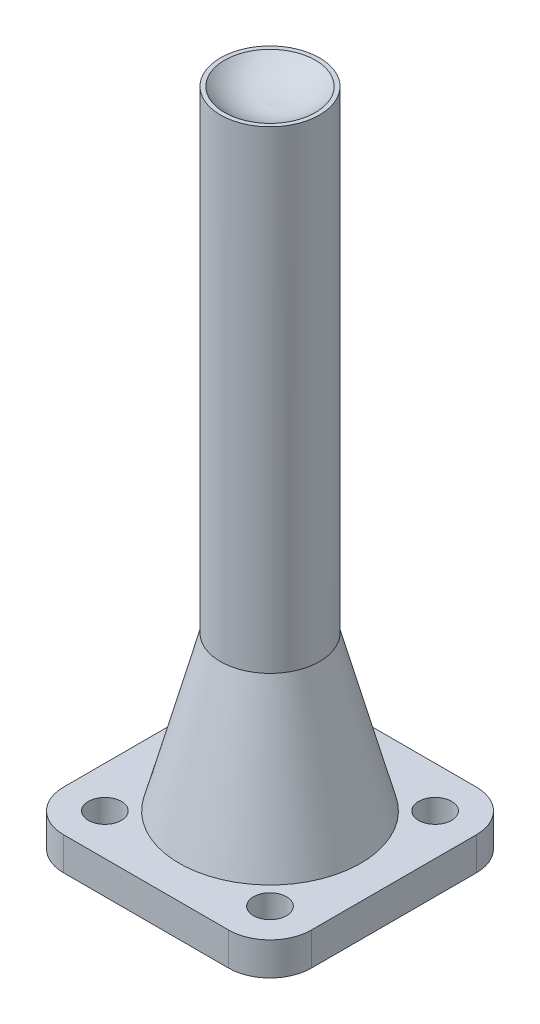
ISO-10303-21;
HEADER;
FILE_DESCRIPTION(('STEP AP214'),'2;1');
FILE_NAME('part.step','',(''),(''),'','','');
FILE_SCHEMA(('AUTOMOTIVE_DESIGN { 1 0 10303 214 1 1 1 1 }'));
ENDSEC;
DATA;
#1=APPLICATION_CONTEXT('core data for automotive mechanical design processes');
#2=APPLICATION_PROTOCOL_DEFINITION('international standard','automotive_design',2000,#1);
#3=PRODUCT_CONTEXT('',#1,'mechanical');
#4=PRODUCT('Part','Part','',(#3));
#5=PRODUCT_RELATED_PRODUCT_CATEGORY('part','',(#4));
#6=PRODUCT_DEFINITION_FORMATION('','',#4);
#7=PRODUCT_DEFINITION_CONTEXT('part definition',#1,'design');
#8=PRODUCT_DEFINITION('design','',#6,#7);
#9=PRODUCT_DEFINITION_SHAPE('','',#8);
#10=(LENGTH_UNIT() NAMED_UNIT(*) SI_UNIT(.MILLI.,.METRE.));
#11=(NAMED_UNIT(*) PLANE_ANGLE_UNIT() SI_UNIT($,.RADIAN.));
#12=(NAMED_UNIT(*) SI_UNIT($,.STERADIAN.) SOLID_ANGLE_UNIT());
#13=UNCERTAINTY_MEASURE_WITH_UNIT(LENGTH_MEASURE(1.E-05),#10,'distance_accuracy_value','');
#14=(GEOMETRIC_REPRESENTATION_CONTEXT(3) GLOBAL_UNCERTAINTY_ASSIGNED_CONTEXT((#13)) GLOBAL_UNIT_ASSIGNED_CONTEXT((#10,
#11,#12)) REPRESENTATION_CONTEXT('',''));
#15=CARTESIAN_POINT('',(0.,0.,0.));
#16=DIRECTION('',(0.,0.,1.));
#17=DIRECTION('',(1.,0.,0.));
#18=AXIS2_PLACEMENT_3D('',#15,#16,#17);
#19=CARTESIAN_POINT('',(0.,4.,0.));
#20=DIRECTION('',(0.,-1.,0.));
#21=DIRECTION('',(0.,0.,-1.));
#22=AXIS2_PLACEMENT_3D('',#19,#20,#21);
#23=PLANE('',#22);
#24=CARTESIAN_POINT('',(0.,4.,0.));
#25=DIRECTION('',(0.,-1.,0.));
#26=DIRECTION('',(0.,0.,-1.));
#27=AXIS2_PLACEMENT_3D('',#24,#25,#26);
#28=CIRCLE('',#27,11.);
#29=CARTESIAN_POINT('',(0.,4.,-11.));
#30=VERTEX_POINT('',#29);
#31=EDGE_CURVE('E11',#30,#30,#28,.T.);
#32=ORIENTED_EDGE('',*,*,#31,.T.);
#33=EDGE_LOOP('',(#32));
#34=FACE_BOUND('',#33,.T.);
#35=DIRECTION('',(1.,0.,0.));
#36=VECTOR('',#35,1.);
#37=CARTESIAN_POINT('',(-15.,4.,15.));
#38=LINE('',#37,#36);
#39=CARTESIAN_POINT('',(-10.,4.,15.));
#40=VERTEX_POINT('',#39);
#41=CARTESIAN_POINT('',(10.,4.,15.));
#42=VERTEX_POINT('',#41);
#43=EDGE_CURVE('E156',#40,#42,#38,.T.);
#44=ORIENTED_EDGE('',*,*,#43,.T.);
#45=CARTESIAN_POINT('',(10.,4.,10.));
#46=DIRECTION('',(0.,-1.,0.));
#47=DIRECTION('',(0.,0.,-1.));
#48=AXIS2_PLACEMENT_3D('',#45,#46,#47);
#49=CIRCLE('',#48,5.);
#50=CARTESIAN_POINT('',(15.,4.,10.));
#51=VERTEX_POINT('',#50);
#52=EDGE_CURVE('E191',#42,#51,#49,.F.);
#53=ORIENTED_EDGE('',*,*,#52,.T.);
#54=DIRECTION('',(0.,0.,-1.));
#55=VECTOR('',#54,1.);
#56=CARTESIAN_POINT('',(15.,4.,15.));
#57=LINE('',#56,#55);
#58=CARTESIAN_POINT('',(15.,4.,-10.));
#59=VERTEX_POINT('',#58);
#60=EDGE_CURVE('E148',#51,#59,#57,.T.);
#61=ORIENTED_EDGE('',*,*,#60,.T.);
#62=CARTESIAN_POINT('',(10.,4.,-10.));
#63=DIRECTION('',(0.,-1.,0.));
#64=DIRECTION('',(0.,0.,-1.));
#65=AXIS2_PLACEMENT_3D('',#62,#63,#64);
#66=CIRCLE('',#65,5.);
#67=CARTESIAN_POINT('',(10.,4.,-15.));
#68=VERTEX_POINT('',#67);
#69=EDGE_CURVE('E188',#59,#68,#66,.F.);
#70=ORIENTED_EDGE('',*,*,#69,.T.);
#71=DIRECTION('',(-1.,0.,0.));
#72=VECTOR('',#71,1.);
#73=CARTESIAN_POINT('',(-15.,4.,-15.));
#74=LINE('',#73,#72);
#75=CARTESIAN_POINT('',(-10.,4.,-15.));
#76=VERTEX_POINT('',#75);
#77=EDGE_CURVE('E151',#68,#76,#74,.T.);
#78=ORIENTED_EDGE('',*,*,#77,.T.);
#79=CARTESIAN_POINT('',(-10.,4.,-10.));
#80=DIRECTION('',(0.,-1.,0.));
#81=DIRECTION('',(0.,0.,-1.));
#82=AXIS2_PLACEMENT_3D('',#79,#80,#81);
#83=CIRCLE('',#82,5.);
#84=CARTESIAN_POINT('',(-15.,4.,-10.));
#85=VERTEX_POINT('',#84);
#86=EDGE_CURVE('E63',#76,#85,#83,.F.);
#87=ORIENTED_EDGE('',*,*,#86,.T.);
#88=DIRECTION('',(0.,0.,1.));
#89=VECTOR('',#88,1.);
#90=CARTESIAN_POINT('',(-15.,4.,15.));
#91=LINE('',#90,#89);
#92=CARTESIAN_POINT('',(-15.,4.,10.));
#93=VERTEX_POINT('',#92);
#94=EDGE_CURVE('E154',#85,#93,#91,.T.);
#95=ORIENTED_EDGE('',*,*,#94,.T.);
#96=CARTESIAN_POINT('',(-10.,4.,10.));
#97=DIRECTION('',(0.,-1.,0.));
#98=DIRECTION('',(0.,0.,-1.));
#99=AXIS2_PLACEMENT_3D('',#96,#97,#98);
#100=CIRCLE('',#99,5.);
#101=EDGE_CURVE('E186',#93,#40,#100,.F.);
#102=ORIENTED_EDGE('',*,*,#101,.T.);
#103=EDGE_LOOP('',(#44,#53,#61,#70,#78,#87,#95,#102));
#104=FACE_BOUND('',#103,.T.);
#105=CARTESIAN_POINT('',(-10.,4.,-10.));
#106=DIRECTION('',(0.,1.,0.));
#107=DIRECTION('',(0.,0.,1.));
#108=AXIS2_PLACEMENT_3D('',#105,#106,#107);
#109=CIRCLE('',#108,2.);
#110=CARTESIAN_POINT('',(-10.,4.,-8.));
#111=VERTEX_POINT('',#110);
#112=EDGE_CURVE('E142',#111,#111,#109,.T.);
#113=ORIENTED_EDGE('',*,*,#112,.F.);
#114=EDGE_LOOP('',(#113));
#115=FACE_BOUND('',#114,.T.);
#116=CARTESIAN_POINT('',(10.,4.,-10.));
#117=DIRECTION('',(0.,1.,0.));
#118=DIRECTION('',(0.,0.,1.));
#119=AXIS2_PLACEMENT_3D('',#116,#117,#118);
#120=CIRCLE('',#119,2.);
#121=CARTESIAN_POINT('',(10.,4.,-8.));
#122=VERTEX_POINT('',#121);
#123=EDGE_CURVE('E136',#122,#122,#120,.T.);
#124=ORIENTED_EDGE('',*,*,#123,.F.);
#125=EDGE_LOOP('',(#124));
#126=FACE_BOUND('',#125,.T.);
#127=CARTESIAN_POINT('',(10.,4.,10.));
#128=DIRECTION('',(0.,1.,0.));
#129=DIRECTION('',(0.,0.,1.));
#130=AXIS2_PLACEMENT_3D('',#127,#128,#129);
#131=CIRCLE('',#130,2.);
#132=CARTESIAN_POINT('',(10.,4.,12.));
#133=VERTEX_POINT('',#132);
#134=EDGE_CURVE('E130',#133,#133,#131,.T.);
#135=ORIENTED_EDGE('',*,*,#134,.F.);
#136=EDGE_LOOP('',(#135));
#137=FACE_BOUND('',#136,.T.);
#138=CARTESIAN_POINT('',(-10.,4.,10.));
#139=DIRECTION('',(0.,1.,0.));
#140=DIRECTION('',(0.,0.,1.));
#141=AXIS2_PLACEMENT_3D('',#138,#139,#140);
#142=CIRCLE('',#141,2.);
#143=CARTESIAN_POINT('',(-10.,4.,12.));
#144=VERTEX_POINT('',#143);
#145=EDGE_CURVE('E124',#144,#144,#142,.T.);
#146=ORIENTED_EDGE('',*,*,#145,.F.);
#147=EDGE_LOOP('',(#146));
#148=FACE_BOUND('',#147,.T.);
#149=ADVANCED_FACE('F40',(#34,#104,#115,#126,#137,#148),#23,.F.);
#150=CARTESIAN_POINT('',(0.,0.,0.));
#151=DIRECTION('',(0.,-1.,0.));
#152=DIRECTION('',(0.,0.,-1.));
#153=AXIS2_PLACEMENT_3D('',#150,#151,#152);
#154=PLANE('',#153);
#155=CARTESIAN_POINT('',(10.,0.,10.));
#156=DIRECTION('',(0.,1.,0.));
#157=DIRECTION('',(0.,0.,1.));
#158=AXIS2_PLACEMENT_3D('',#155,#156,#157);
#159=CIRCLE('',#158,2.);
#160=CARTESIAN_POINT('',(10.,0.,12.));
#161=VERTEX_POINT('',#160);
#162=EDGE_CURVE('E127',#161,#161,#159,.T.);
#163=ORIENTED_EDGE('',*,*,#162,.T.);
#164=EDGE_LOOP('',(#163));
#165=FACE_BOUND('',#164,.T.);
#166=CARTESIAN_POINT('',(-10.,0.,-10.));
#167=DIRECTION('',(0.,1.,0.));
#168=DIRECTION('',(0.,0.,1.));
#169=AXIS2_PLACEMENT_3D('',#166,#167,#168);
#170=CIRCLE('',#169,2.);
#171=CARTESIAN_POINT('',(-10.,0.,-8.));
#172=VERTEX_POINT('',#171);
#173=EDGE_CURVE('E139',#172,#172,#170,.T.);
#174=ORIENTED_EDGE('',*,*,#173,.T.);
#175=EDGE_LOOP('',(#174));
#176=FACE_BOUND('',#175,.T.);
#177=DIRECTION('',(0.,0.,-1.));
#178=VECTOR('',#177,1.);
#179=CARTESIAN_POINT('',(15.,0.,15.));
#180=LINE('',#179,#178);
#181=CARTESIAN_POINT('',(15.,0.,10.));
#182=VERTEX_POINT('',#181);
#183=CARTESIAN_POINT('',(15.,0.,-10.));
#184=VERTEX_POINT('',#183);
#185=EDGE_CURVE('E145',#182,#184,#180,.T.);
#186=ORIENTED_EDGE('',*,*,#185,.F.);
#187=CARTESIAN_POINT('',(10.,0.,10.));
#188=DIRECTION('',(0.,-1.,0.));
#189=DIRECTION('',(0.,0.,-1.));
#190=AXIS2_PLACEMENT_3D('',#187,#188,#189);
#191=CIRCLE('',#190,5.);
#192=CARTESIAN_POINT('',(10.,0.,15.));
#193=VERTEX_POINT('',#192);
#194=EDGE_CURVE('E179',#182,#193,#191,.T.);
#195=ORIENTED_EDGE('',*,*,#194,.T.);
#196=DIRECTION('',(1.,0.,0.));
#197=VECTOR('',#196,1.);
#198=CARTESIAN_POINT('',(-15.,0.,15.));
#199=LINE('',#198,#197);
#200=CARTESIAN_POINT('',(-10.,0.,15.));
#201=VERTEX_POINT('',#200);
#202=EDGE_CURVE('E152',#201,#193,#199,.T.);
#203=ORIENTED_EDGE('',*,*,#202,.F.);
#204=CARTESIAN_POINT('',(-10.,0.,10.));
#205=DIRECTION('',(0.,-1.,0.));
#206=DIRECTION('',(0.,0.,-1.));
#207=AXIS2_PLACEMENT_3D('',#204,#205,#206);
#208=CIRCLE('',#207,5.);
#209=CARTESIAN_POINT('',(-15.,0.,10.));
#210=VERTEX_POINT('',#209);
#211=EDGE_CURVE('E173',#201,#210,#208,.T.);
#212=ORIENTED_EDGE('',*,*,#211,.T.);
#213=DIRECTION('',(0.,0.,1.));
#214=VECTOR('',#213,1.);
#215=CARTESIAN_POINT('',(-15.,0.,15.));
#216=LINE('',#215,#214);
#217=CARTESIAN_POINT('',(-15.,0.,-10.));
#218=VERTEX_POINT('',#217);
#219=EDGE_CURVE('E165',#218,#210,#216,.T.);
#220=ORIENTED_EDGE('',*,*,#219,.F.);
#221=CARTESIAN_POINT('',(-10.,0.,-10.));
#222=DIRECTION('',(0.,-1.,0.));
#223=DIRECTION('',(0.,0.,-1.));
#224=AXIS2_PLACEMENT_3D('',#221,#222,#223);
#225=CIRCLE('',#224,5.);
#226=CARTESIAN_POINT('',(-10.,0.,-15.));
#227=VERTEX_POINT('',#226);
#228=EDGE_CURVE('E177',#218,#227,#225,.T.);
#229=ORIENTED_EDGE('',*,*,#228,.T.);
#230=DIRECTION('',(-1.,0.,0.));
#231=VECTOR('',#230,1.);
#232=CARTESIAN_POINT('',(-15.,0.,-15.));
#233=LINE('',#232,#231);
#234=CARTESIAN_POINT('',(10.,0.,-15.));
#235=VERTEX_POINT('',#234);
#236=EDGE_CURVE('E162',#235,#227,#233,.T.);
#237=ORIENTED_EDGE('',*,*,#236,.F.);
#238=CARTESIAN_POINT('',(10.,0.,-10.));
#239=DIRECTION('',(0.,-1.,0.));
#240=DIRECTION('',(0.,0.,-1.));
#241=AXIS2_PLACEMENT_3D('',#238,#239,#240);
#242=CIRCLE('',#241,5.);
#243=EDGE_CURVE('E175',#235,#184,#242,.T.);
#244=ORIENTED_EDGE('',*,*,#243,.T.);
#245=EDGE_LOOP('',(#186,#195,#203,#212,#220,#229,#237,#244));
#246=FACE_BOUND('',#245,.T.);
#247=CARTESIAN_POINT('',(10.,0.,-10.));
#248=DIRECTION('',(0.,1.,0.));
#249=DIRECTION('',(0.,0.,1.));
#250=AXIS2_PLACEMENT_3D('',#247,#248,#249);
#251=CIRCLE('',#250,2.);
#252=CARTESIAN_POINT('',(10.,0.,-8.));
#253=VERTEX_POINT('',#252);
#254=EDGE_CURVE('E133',#253,#253,#251,.T.);
#255=ORIENTED_EDGE('',*,*,#254,.T.);
#256=EDGE_LOOP('',(#255));
#257=FACE_BOUND('',#256,.T.);
#258=CARTESIAN_POINT('',(-10.,0.,10.));
#259=DIRECTION('',(0.,1.,0.));
#260=DIRECTION('',(0.,0.,1.));
#261=AXIS2_PLACEMENT_3D('',#258,#259,#260);
#262=CIRCLE('',#261,2.);
#263=CARTESIAN_POINT('',(-10.,0.,12.));
#264=VERTEX_POINT('',#263);
#265=EDGE_CURVE('E121',#264,#264,#262,.T.);
#266=ORIENTED_EDGE('',*,*,#265,.T.);
#267=EDGE_LOOP('',(#266));
#268=FACE_BOUND('',#267,.T.);
#269=ADVANCED_FACE('F213',(#165,#176,#246,#257,#268),#154,.T.);
#270=CARTESIAN_POINT('',(15.,4.,15.));
#271=DIRECTION('',(-1.,0.,0.));
#272=DIRECTION('',(0.,0.,1.));
#273=AXIS2_PLACEMENT_3D('',#270,#271,#272);
#274=PLANE('',#273);
#275=ORIENTED_EDGE('',*,*,#60,.F.);
#276=DIRECTION('',(0.,-1.,0.));
#277=VECTOR('',#276,1.);
#278=CARTESIAN_POINT('',(15.,4.,10.));
#279=LINE('',#278,#277);
#280=EDGE_CURVE('E170',#51,#182,#279,.T.);
#281=ORIENTED_EDGE('',*,*,#280,.T.);
#282=ORIENTED_EDGE('',*,*,#185,.T.);
#283=DIRECTION('',(0.,-1.,0.));
#284=VECTOR('',#283,1.);
#285=CARTESIAN_POINT('',(15.,4.,-10.));
#286=LINE('',#285,#284);
#287=EDGE_CURVE('E159',#184,#59,#286,.F.);
#288=ORIENTED_EDGE('',*,*,#287,.T.);
#289=EDGE_LOOP('',(#275,#281,#282,#288));
#290=FACE_BOUND('',#289,.T.);
#291=ADVANCED_FACE('F219',(#290),#274,.F.);
#292=CARTESIAN_POINT('',(-15.,4.,-15.));
#293=DIRECTION('',(0.,0.,1.));
#294=DIRECTION('',(1.,0.,0.));
#295=AXIS2_PLACEMENT_3D('',#292,#293,#294);
#296=PLANE('',#295);
#297=ORIENTED_EDGE('',*,*,#236,.T.);
#298=DIRECTION('',(0.,-1.,0.));
#299=VECTOR('',#298,1.);
#300=CARTESIAN_POINT('',(-10.,4.,-15.));
#301=LINE('',#300,#299);
#302=EDGE_CURVE('E200',#227,#76,#301,.F.);
#303=ORIENTED_EDGE('',*,*,#302,.T.);
#304=ORIENTED_EDGE('',*,*,#77,.F.);
#305=DIRECTION('',(0.,-1.,0.));
#306=VECTOR('',#305,1.);
#307=CARTESIAN_POINT('',(10.,4.,-15.));
#308=LINE('',#307,#306);
#309=EDGE_CURVE('E197',#68,#235,#308,.T.);
#310=ORIENTED_EDGE('',*,*,#309,.T.);
#311=EDGE_LOOP('',(#297,#303,#304,#310));
#312=FACE_BOUND('',#311,.T.);
#313=ADVANCED_FACE('F233',(#312),#296,.F.);
#314=CARTESIAN_POINT('',(-15.,4.,15.));
#315=DIRECTION('',(1.,0.,0.));
#316=DIRECTION('',(0.,0.,-1.));
#317=AXIS2_PLACEMENT_3D('',#314,#315,#316);
#318=PLANE('',#317);
#319=ORIENTED_EDGE('',*,*,#94,.F.);
#320=DIRECTION('',(0.,-1.,0.));
#321=VECTOR('',#320,1.);
#322=CARTESIAN_POINT('',(-15.,4.,-10.));
#323=LINE('',#322,#321);
#324=EDGE_CURVE('E194',#85,#218,#323,.T.);
#325=ORIENTED_EDGE('',*,*,#324,.T.);
#326=ORIENTED_EDGE('',*,*,#219,.T.);
#327=DIRECTION('',(0.,-1.,0.));
#328=VECTOR('',#327,1.);
#329=CARTESIAN_POINT('',(-15.,4.,10.));
#330=LINE('',#329,#328);
#331=EDGE_CURVE('E56',#210,#93,#330,.F.);
#332=ORIENTED_EDGE('',*,*,#331,.T.);
#333=EDGE_LOOP('',(#319,#325,#326,#332));
#334=FACE_BOUND('',#333,.T.);
#335=ADVANCED_FACE('F229',(#334),#318,.F.);
#336=CARTESIAN_POINT('',(-15.,4.,15.));
#337=DIRECTION('',(0.,0.,-1.));
#338=DIRECTION('',(-1.,0.,0.));
#339=AXIS2_PLACEMENT_3D('',#336,#337,#338);
#340=PLANE('',#339);
#341=ORIENTED_EDGE('',*,*,#202,.T.);
#342=DIRECTION('',(0.,-1.,0.));
#343=VECTOR('',#342,1.);
#344=CARTESIAN_POINT('',(10.,4.,15.));
#345=LINE('',#344,#343);
#346=EDGE_CURVE('E184',#193,#42,#345,.F.);
#347=ORIENTED_EDGE('',*,*,#346,.T.);
#348=ORIENTED_EDGE('',*,*,#43,.F.);
#349=DIRECTION('',(0.,-1.,0.));
#350=VECTOR('',#349,1.);
#351=CARTESIAN_POINT('',(-10.,4.,15.));
#352=LINE('',#351,#350);
#353=EDGE_CURVE('E181',#40,#201,#352,.T.);
#354=ORIENTED_EDGE('',*,*,#353,.T.);
#355=EDGE_LOOP('',(#341,#347,#348,#354));
#356=FACE_BOUND('',#355,.T.);
#357=ADVANCED_FACE('F226',(#356),#340,.F.);
#358=CARTESIAN_POINT('',(-10.,4.,-10.));
#359=DIRECTION('',(0.,-1.,0.));
#360=DIRECTION('',(0.,0.,-1.));
#361=AXIS2_PLACEMENT_3D('',#358,#359,#360);
#362=CYLINDRICAL_SURFACE('',#361,2.);
#363=ORIENTED_EDGE('',*,*,#112,.T.);
#364=EDGE_LOOP('',(#363));
#365=FACE_BOUND('',#364,.T.);
#366=ORIENTED_EDGE('',*,*,#173,.F.);
#367=EDGE_LOOP('',(#366));
#368=FACE_BOUND('',#367,.T.);
#369=ADVANCED_FACE('F223',(#365,#368),#362,.F.);
#370=CARTESIAN_POINT('',(10.,4.,-10.));
#371=DIRECTION('',(0.,-1.,0.));
#372=DIRECTION('',(0.,0.,-1.));
#373=AXIS2_PLACEMENT_3D('',#370,#371,#372);
#374=CYLINDRICAL_SURFACE('',#373,2.);
#375=ORIENTED_EDGE('',*,*,#123,.T.);
#376=EDGE_LOOP('',(#375));
#377=FACE_BOUND('',#376,.T.);
#378=ORIENTED_EDGE('',*,*,#254,.F.);
#379=EDGE_LOOP('',(#378));
#380=FACE_BOUND('',#379,.T.);
#381=ADVANCED_FACE('F290',(#377,#380),#374,.F.);
#382=CARTESIAN_POINT('',(10.,4.,10.));
#383=DIRECTION('',(0.,-1.,0.));
#384=DIRECTION('',(0.,0.,-1.));
#385=AXIS2_PLACEMENT_3D('',#382,#383,#384);
#386=CYLINDRICAL_SURFACE('',#385,2.);
#387=ORIENTED_EDGE('',*,*,#134,.T.);
#388=EDGE_LOOP('',(#387));
#389=FACE_BOUND('',#388,.T.);
#390=ORIENTED_EDGE('',*,*,#162,.F.);
#391=EDGE_LOOP('',(#390));
#392=FACE_BOUND('',#391,.T.);
#393=ADVANCED_FACE('F284',(#389,#392),#386,.F.);
#394=CARTESIAN_POINT('',(-10.,4.,10.));
#395=DIRECTION('',(0.,-1.,0.));
#396=DIRECTION('',(0.,0.,-1.));
#397=AXIS2_PLACEMENT_3D('',#394,#395,#396);
#398=CYLINDRICAL_SURFACE('',#397,2.);
#399=ORIENTED_EDGE('',*,*,#145,.T.);
#400=EDGE_LOOP('',(#399));
#401=FACE_BOUND('',#400,.T.);
#402=ORIENTED_EDGE('',*,*,#265,.F.);
#403=EDGE_LOOP('',(#402));
#404=FACE_BOUND('',#403,.T.);
#405=ADVANCED_FACE('F244',(#401,#404),#398,.F.);
#406=CARTESIAN_POINT('',(10.,4.,10.));
#407=DIRECTION('',(0.,-1.,0.));
#408=DIRECTION('',(0.,0.,-1.));
#409=AXIS2_PLACEMENT_3D('',#406,#407,#408);
#410=CYLINDRICAL_SURFACE('',#409,5.);
#411=ORIENTED_EDGE('',*,*,#52,.F.);
#412=ORIENTED_EDGE('',*,*,#346,.F.);
#413=ORIENTED_EDGE('',*,*,#194,.F.);
#414=ORIENTED_EDGE('',*,*,#280,.F.);
#415=EDGE_LOOP('',(#411,#412,#413,#414));
#416=FACE_BOUND('',#415,.T.);
#417=ADVANCED_FACE('F240',(#416),#410,.T.);
#418=CARTESIAN_POINT('',(-10.,4.,-10.));
#419=DIRECTION('',(0.,-1.,0.));
#420=DIRECTION('',(0.,0.,-1.));
#421=AXIS2_PLACEMENT_3D('',#418,#419,#420);
#422=CYLINDRICAL_SURFACE('',#421,5.);
#423=ORIENTED_EDGE('',*,*,#86,.F.);
#424=ORIENTED_EDGE('',*,*,#302,.F.);
#425=ORIENTED_EDGE('',*,*,#228,.F.);
#426=ORIENTED_EDGE('',*,*,#324,.F.);
#427=EDGE_LOOP('',(#423,#424,#425,#426));
#428=FACE_BOUND('',#427,.T.);
#429=ADVANCED_FACE('F243',(#428),#422,.T.);
#430=CARTESIAN_POINT('',(10.,4.,-10.));
#431=DIRECTION('',(0.,-1.,0.));
#432=DIRECTION('',(0.,0.,-1.));
#433=AXIS2_PLACEMENT_3D('',#430,#431,#432);
#434=CYLINDRICAL_SURFACE('',#433,5.);
#435=ORIENTED_EDGE('',*,*,#69,.F.);
#436=ORIENTED_EDGE('',*,*,#287,.F.);
#437=ORIENTED_EDGE('',*,*,#243,.F.);
#438=ORIENTED_EDGE('',*,*,#309,.F.);
#439=EDGE_LOOP('',(#435,#436,#437,#438));
#440=FACE_BOUND('',#439,.T.);
#441=ADVANCED_FACE('F248',(#440),#434,.T.);
#442=CARTESIAN_POINT('',(-10.,4.,10.));
#443=DIRECTION('',(0.,-1.,0.));
#444=DIRECTION('',(0.,0.,-1.));
#445=AXIS2_PLACEMENT_3D('',#442,#443,#444);
#446=CYLINDRICAL_SURFACE('',#445,5.);
#447=ORIENTED_EDGE('',*,*,#101,.F.);
#448=ORIENTED_EDGE('',*,*,#331,.F.);
#449=ORIENTED_EDGE('',*,*,#211,.F.);
#450=ORIENTED_EDGE('',*,*,#353,.F.);
#451=EDGE_LOOP('',(#447,#448,#449,#450));
#452=FACE_BOUND('',#451,.T.);
#453=ADVANCED_FACE('F251',(#452),#446,.T.);
#454=CARTESIAN_POINT('',(0.,80.,0.));
#455=DIRECTION('',(0.,-1.,0.));
#456=DIRECTION('',(0.,0.,-1.));
#457=AXIS2_PLACEMENT_3D('',#454,#455,#456);
#458=CYLINDRICAL_SURFACE('',#457,6.);
#459=CARTESIAN_POINT('',(0.,22.6602540378448,0.));
#460=DIRECTION('',(0.,-1.,0.));
#461=DIRECTION('',(0.,0.,-1.));
#462=AXIS2_PLACEMENT_3D('',#459,#460,#461);
#463=CIRCLE('',#462,6.);
#464=CARTESIAN_POINT('',(0.,22.6602540378448,-6.));
#465=VERTEX_POINT('',#464);
#466=EDGE_CURVE('E49',#465,#465,#463,.F.);
#467=ORIENTED_EDGE('',*,*,#466,.T.);
#468=EDGE_LOOP('',(#467));
#469=FACE_BOUND('',#468,.T.);
#470=CARTESIAN_POINT('',(0.,80.,0.));
#471=DIRECTION('',(0.,1.,0.));
#472=DIRECTION('',(0.,0.,1.));
#473=AXIS2_PLACEMENT_3D('',#470,#471,#472);
#474=CIRCLE('',#473,6.);
#475=CARTESIAN_POINT('',(0.,80.,6.));
#476=VERTEX_POINT('',#475);
#477=EDGE_CURVE('E118',#476,#476,#474,.T.);
#478=ORIENTED_EDGE('',*,*,#477,.F.);
#479=EDGE_LOOP('',(#478));
#480=FACE_BOUND('',#479,.T.);
#481=ADVANCED_FACE('F204',(#469,#480),#458,.T.);
#482=CARTESIAN_POINT('',(0.,80.,0.));
#483=DIRECTION('',(0.,1.,0.));
#484=DIRECTION('',(0.,0.,1.));
#485=AXIS2_PLACEMENT_3D('',#482,#483,#484);
#486=PLANE('',#485);
#487=CARTESIAN_POINT('',(0.,80.,0.));
#488=DIRECTION('',(0.,1.,0.));
#489=DIRECTION('',(-1.,0.,0.));
#490=AXIS2_PLACEMENT_3D('',#487,#488,#489);
#491=CIRCLE('',#490,5.5);
#492=CARTESIAN_POINT('',(-5.5,80.,0.));
#493=VERTEX_POINT('',#492);
#494=EDGE_CURVE('E116',#493,#493,#491,.T.);
#495=ORIENTED_EDGE('',*,*,#494,.F.);
#496=EDGE_LOOP('',(#495));
#497=FACE_BOUND('',#496,.T.);
#498=ORIENTED_EDGE('',*,*,#477,.T.);
#499=EDGE_LOOP('',(#498));
#500=FACE_BOUND('',#499,.T.);
#501=ADVANCED_FACE('F112',(#497,#500),#486,.T.);
#502=CARTESIAN_POINT('',(-0.685459934313927,84.6774851806367,0.));
#503=DIRECTION('',(0.,0.,-1.));
#504=DIRECTION('',(-1.,0.,0.));
#505=AXIS2_PLACEMENT_3D('',#502,#503,#504);
#506=CIRCLE('',#505,6.71257503936994);
#507=TRIMMED_CURVE('',#506,(PARAMETER_VALUE(-1.67309043047333)),
(PARAMETER_VALUE(1.67309043047333)),.T.,.PARAMETER.);
#508=CARTESIAN_POINT('',(0.,84.6774851806367,0.));
#509=DIRECTION('',(0.,1.,0.));
#510=AXIS1_PLACEMENT('',#508,#509);
#511=SURFACE_OF_REVOLUTION('',#507,#510);
#512=CARTESIAN_POINT('',(0.,78.,0.));
#513=VERTEX_POINT('',#512);
#514=VERTEX_LOOP('',#513);
#515=FACE_BOUND('',#514,.T.);
#516=ORIENTED_EDGE('',*,*,#494,.T.);
#517=EDGE_LOOP('',(#516));
#518=FACE_BOUND('',#517,.T.);
#519=ADVANCED_FACE('F109',(#515,#518),#511,.F.);
#520=CARTESIAN_POINT('',(0.,22.6602540378448,0.));
#521=DIRECTION('',(0.,-1.,0.));
#522=DIRECTION('',(0.,0.,-1.));
#523=AXIS2_PLACEMENT_3D('',#520,#521,#522);
#524=CONICAL_SURFACE('',#523,6.,0.261799387799143);
#525=ORIENTED_EDGE('',*,*,#31,.F.);
#526=EDGE_LOOP('',(#525));
#527=FACE_BOUND('',#526,.T.);
#528=ORIENTED_EDGE('',*,*,#466,.F.);
#529=EDGE_LOOP('',(#528));
#530=FACE_BOUND('',#529,.T.);
#531=ADVANCED_FACE('F43',(#527,#530),#524,.T.);
#532=CLOSED_SHELL('',(#149,#269,#291,#313,#335,#357,#369,#381,#393,#405,#417,#429,#441,#453,
#481,#501,#519,#531));
#533=MANIFOLD_SOLID_BREP('B2',#532);
#534=ADVANCED_BREP_SHAPE_REPRESENTATION('',(#18,#533),#14);
#535=SHAPE_DEFINITION_REPRESENTATION(#9,#534);
ENDSEC;
END-ISO-10303-21;
